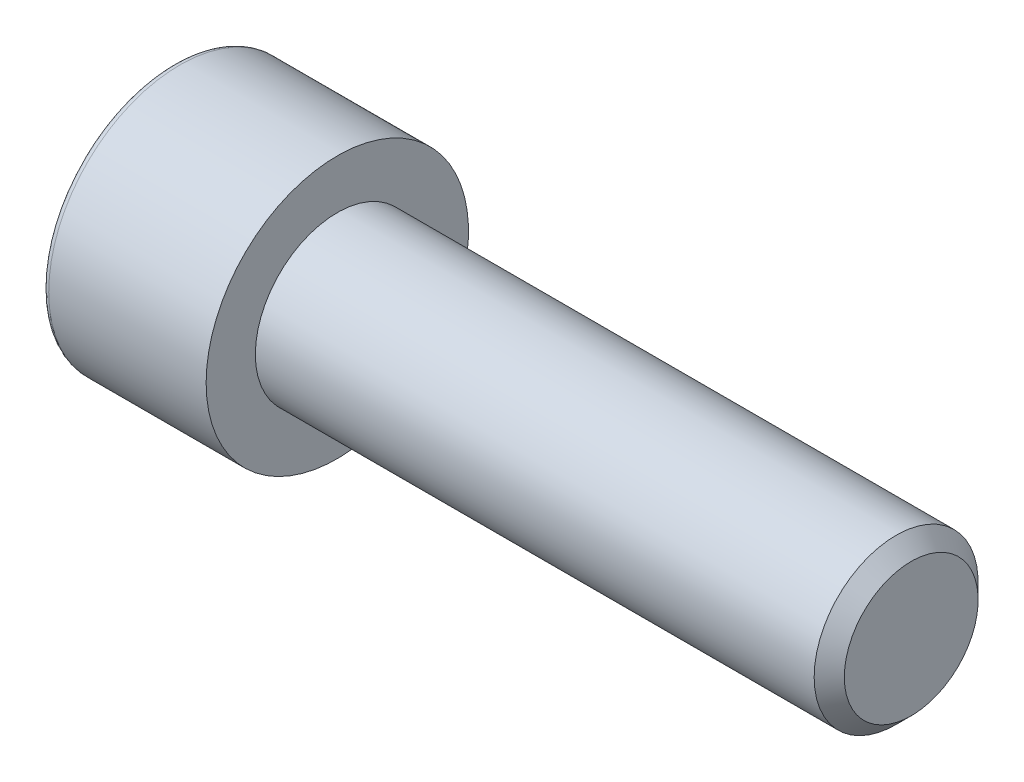
ISO-10303-21;
HEADER;
FILE_DESCRIPTION(('STEP AP214'),'2;1');
FILE_NAME('part.step','',(''),(''),'','','');
FILE_SCHEMA(('AUTOMOTIVE_DESIGN { 1 0 10303 214 1 1 1 1 }'));
ENDSEC;
DATA;
#1=APPLICATION_CONTEXT('core data for automotive mechanical design processes');
#2=APPLICATION_PROTOCOL_DEFINITION('international standard','automotive_design',2000,#1);
#3=PRODUCT_CONTEXT('',#1,'mechanical');
#4=PRODUCT('Part','Part','',(#3));
#5=PRODUCT_RELATED_PRODUCT_CATEGORY('part','',(#4));
#6=PRODUCT_DEFINITION_FORMATION('','',#4);
#7=PRODUCT_DEFINITION_CONTEXT('part definition',#1,'design');
#8=PRODUCT_DEFINITION('design','',#6,#7);
#9=PRODUCT_DEFINITION_SHAPE('','',#8);
#10=(LENGTH_UNIT() NAMED_UNIT(*) SI_UNIT(.MILLI.,.METRE.));
#11=(NAMED_UNIT(*) PLANE_ANGLE_UNIT() SI_UNIT($,.RADIAN.));
#12=(NAMED_UNIT(*) SI_UNIT($,.STERADIAN.) SOLID_ANGLE_UNIT());
#13=UNCERTAINTY_MEASURE_WITH_UNIT(LENGTH_MEASURE(1.E-05),#10,'distance_accuracy_value','');
#14=(GEOMETRIC_REPRESENTATION_CONTEXT(3) GLOBAL_UNCERTAINTY_ASSIGNED_CONTEXT((#13)) GLOBAL_UNIT_ASSIGNED_CONTEXT((#10,
#11,#12)) REPRESENTATION_CONTEXT('',''));
#15=CARTESIAN_POINT('',(0.,0.,0.));
#16=DIRECTION('',(0.,0.,1.));
#17=DIRECTION('',(1.,0.,0.));
#18=AXIS2_PLACEMENT_3D('',#15,#16,#17);
#19=CARTESIAN_POINT('',(0.,0.,0.));
#20=DIRECTION('',(1.,0.,0.));
#21=DIRECTION('',(0.,0.,-1.));
#22=AXIS2_PLACEMENT_3D('',#19,#20,#21);
#23=PLANE('',#22);
#24=DIRECTION('',(0.,-0.5,0.866025403784439));
#25=VECTOR('',#24,1.);
#26=CARTESIAN_POINT('',(0.,4.61880215351701,0.));
#27=LINE('',#26,#25);
#28=CARTESIAN_POINT('',(0.,4.61880215351701,0.));
#29=VERTEX_POINT('',#28);
#30=CARTESIAN_POINT('',(0.,2.3094010767585,4.));
#31=VERTEX_POINT('',#30);
#32=EDGE_CURVE('E100',#29,#31,#27,.T.);
#33=ORIENTED_EDGE('',*,*,#32,.T.);
#34=DIRECTION('',(0.,-1.,0.));
#35=VECTOR('',#34,1.);
#36=CARTESIAN_POINT('',(0.,2.3094010767585,4.));
#37=LINE('',#36,#35);
#38=CARTESIAN_POINT('',(0.,-2.3094010767585,4.));
#39=VERTEX_POINT('',#38);
#40=EDGE_CURVE('E107',#31,#39,#37,.T.);
#41=ORIENTED_EDGE('',*,*,#40,.T.);
#42=DIRECTION('',(0.,-0.5,-0.866025403784439));
#43=VECTOR('',#42,1.);
#44=CARTESIAN_POINT('',(0.,-2.3094010767585,4.));
#45=LINE('',#44,#43);
#46=CARTESIAN_POINT('',(0.,-4.61880215351701,0.));
#47=VERTEX_POINT('',#46);
#48=EDGE_CURVE('E113',#39,#47,#45,.T.);
#49=ORIENTED_EDGE('',*,*,#48,.T.);
#50=DIRECTION('',(0.,0.5,-0.866025403784439));
#51=VECTOR('',#50,1.);
#52=CARTESIAN_POINT('',(0.,-4.61880215351701,0.));
#53=LINE('',#52,#51);
#54=CARTESIAN_POINT('',(0.,-2.3094010767585,-4.));
#55=VERTEX_POINT('',#54);
#56=EDGE_CURVE('E122',#47,#55,#53,.T.);
#57=ORIENTED_EDGE('',*,*,#56,.T.);
#58=DIRECTION('',(0.,1.,0.));
#59=VECTOR('',#58,1.);
#60=CARTESIAN_POINT('',(0.,-2.3094010767585,-4.));
#61=LINE('',#60,#59);
#62=CARTESIAN_POINT('',(0.,2.3094010767585,-4.));
#63=VERTEX_POINT('',#62);
#64=EDGE_CURVE('E125',#55,#63,#61,.T.);
#65=ORIENTED_EDGE('',*,*,#64,.T.);
#66=DIRECTION('',(0.,0.5,0.866025403784439));
#67=VECTOR('',#66,1.);
#68=CARTESIAN_POINT('',(0.,2.3094010767585,-4.));
#69=LINE('',#68,#67);
#70=EDGE_CURVE('E118',#63,#29,#69,.T.);
#71=ORIENTED_EDGE('',*,*,#70,.T.);
#72=EDGE_LOOP('',(#33,#41,#49,#57,#65,#71));
#73=FACE_BOUND('',#72,.T.);
#74=CARTESIAN_POINT('',(0.,0.,0.));
#75=DIRECTION('',(-1.,0.,0.));
#76=DIRECTION('',(0.,0.,1.));
#77=AXIS2_PLACEMENT_3D('',#74,#75,#76);
#78=CIRCLE('',#77,7.6);
#79=CARTESIAN_POINT('',(0.,0.,7.6));
#80=VERTEX_POINT('',#79);
#81=EDGE_CURVE('E142',#80,#80,#78,.T.);
#82=ORIENTED_EDGE('',*,*,#81,.T.);
#83=EDGE_LOOP('',(#82));
#84=FACE_BOUND('',#83,.T.);
#85=ADVANCED_FACE('F39',(#73,#84),#23,.F.);
#86=CARTESIAN_POINT('',(10.,8.,0.));
#87=DIRECTION('',(-1.,0.,0.));
#88=DIRECTION('',(0.,0.,1.));
#89=AXIS2_PLACEMENT_3D('',#86,#87,#88);
#90=PLANE('',#89);
#91=CARTESIAN_POINT('',(10.,0.,0.));
#92=DIRECTION('',(-1.,0.,0.));
#93=DIRECTION('',(0.,0.,1.));
#94=AXIS2_PLACEMENT_3D('',#91,#92,#93);
#95=CIRCLE('',#94,8.);
#96=CARTESIAN_POINT('',(10.,0.,8.));
#97=VERTEX_POINT('',#96);
#98=EDGE_CURVE('E148',#97,#97,#95,.T.);
#99=ORIENTED_EDGE('',*,*,#98,.F.);
#100=EDGE_LOOP('',(#99));
#101=FACE_BOUND('',#100,.T.);
#102=CARTESIAN_POINT('',(10.,0.,0.));
#103=DIRECTION('',(-1.,0.,0.));
#104=DIRECTION('',(0.,0.,1.));
#105=AXIS2_PLACEMENT_3D('',#102,#103,#104);
#106=CIRCLE('',#105,5.);
#107=CARTESIAN_POINT('',(10.,0.,5.));
#108=VERTEX_POINT('',#107);
#109=EDGE_CURVE('E151',#108,#108,#106,.F.);
#110=ORIENTED_EDGE('',*,*,#109,.F.);
#111=EDGE_LOOP('',(#110));
#112=FACE_BOUND('',#111,.T.);
#113=ADVANCED_FACE('F210',(#101,#112),#90,.F.);
#114=CARTESIAN_POINT('',(10.,0.,0.));
#115=DIRECTION('',(-1.,0.,0.));
#116=DIRECTION('',(0.,0.,1.));
#117=AXIS2_PLACEMENT_3D('',#114,#115,#116);
#118=CYLINDRICAL_SURFACE('',#117,8.);
#119=CARTESIAN_POINT('',(0.399999999999999,0.,0.));
#120=DIRECTION('',(-1.,0.,0.));
#121=DIRECTION('',(0.,0.,1.));
#122=AXIS2_PLACEMENT_3D('',#119,#120,#121);
#123=CIRCLE('',#122,8.);
#124=CARTESIAN_POINT('',(0.399999999999999,0.,8.));
#125=VERTEX_POINT('',#124);
#126=EDGE_CURVE('E145',#125,#125,#123,.T.);
#127=ORIENTED_EDGE('',*,*,#126,.F.);
#128=EDGE_LOOP('',(#127));
#129=FACE_BOUND('',#128,.T.);
#130=ORIENTED_EDGE('',*,*,#98,.T.);
#131=EDGE_LOOP('',(#130));
#132=FACE_BOUND('',#131,.T.);
#133=ADVANCED_FACE('F214',(#129,#132),#118,.T.);
#134=CARTESIAN_POINT('',(0.400000000000002,0.,0.));
#135=DIRECTION('',(-1.,0.,0.));
#136=DIRECTION('',(0.,0.,1.));
#137=AXIS2_PLACEMENT_3D('',#134,#135,#136);
#138=TOROIDAL_SURFACE('',#137,7.6,0.400000000000002);
#139=ORIENTED_EDGE('',*,*,#126,.T.);
#140=EDGE_LOOP('',(#139));
#141=FACE_BOUND('',#140,.T.);
#142=ORIENTED_EDGE('',*,*,#81,.F.);
#143=EDGE_LOOP('',(#142));
#144=FACE_BOUND('',#143,.T.);
#145=ADVANCED_FACE('F220',(#141,#144),#138,.T.);
#146=CARTESIAN_POINT('',(45.,0.,0.));
#147=DIRECTION('',(-1.,0.,0.));
#148=DIRECTION('',(0.,0.,1.));
#149=AXIS2_PLACEMENT_3D('',#146,#147,#148);
#150=CYLINDRICAL_SURFACE('',#149,5.);
#151=ORIENTED_EDGE('',*,*,#109,.T.);
#152=EDGE_LOOP('',(#151));
#153=FACE_BOUND('',#152,.T.);
#154=CARTESIAN_POINT('',(44.08,0.,0.));
#155=DIRECTION('',(-1.,0.,0.));
#156=DIRECTION('',(0.,0.,1.));
#157=AXIS2_PLACEMENT_3D('',#154,#155,#156);
#158=CIRCLE('',#157,5.);
#159=CARTESIAN_POINT('',(44.08,0.,5.));
#160=VERTEX_POINT('',#159);
#161=EDGE_CURVE('E139',#160,#160,#158,.T.);
#162=ORIENTED_EDGE('',*,*,#161,.T.);
#163=EDGE_LOOP('',(#162));
#164=FACE_BOUND('',#163,.T.);
#165=ADVANCED_FACE('F227',(#153,#164),#150,.T.);
#166=CARTESIAN_POINT('',(45.,0.,0.));
#167=DIRECTION('',(-1.,0.,0.));
#168=DIRECTION('',(0.,0.,1.));
#169=AXIS2_PLACEMENT_3D('',#166,#167,#168);
#170=CONICAL_SURFACE('',#169,4.08,0.78539816339745);
#171=ORIENTED_EDGE('',*,*,#161,.F.);
#172=EDGE_LOOP('',(#171));
#173=FACE_BOUND('',#172,.T.);
#174=CARTESIAN_POINT('',(45.,0.,0.));
#175=DIRECTION('',(-1.,0.,0.));
#176=DIRECTION('',(0.,0.,1.));
#177=AXIS2_PLACEMENT_3D('',#174,#175,#176);
#178=CIRCLE('',#177,4.08);
#179=CARTESIAN_POINT('',(45.,0.,4.08));
#180=VERTEX_POINT('',#179);
#181=EDGE_CURVE('E103',#180,#180,#178,.T.);
#182=ORIENTED_EDGE('',*,*,#181,.T.);
#183=EDGE_LOOP('',(#182));
#184=FACE_BOUND('',#183,.T.);
#185=ADVANCED_FACE('F207',(#173,#184),#170,.T.);
#186=CARTESIAN_POINT('',(45.,4.08,0.));
#187=DIRECTION('',(-1.,0.,0.));
#188=DIRECTION('',(0.,0.,1.));
#189=AXIS2_PLACEMENT_3D('',#186,#187,#188);
#190=PLANE('',#189);
#191=ORIENTED_EDGE('',*,*,#181,.F.);
#192=EDGE_LOOP('',(#191));
#193=FACE_BOUND('',#192,.T.);
#194=ADVANCED_FACE('F203',(#193),#190,.F.);
#195=CARTESIAN_POINT('',(7.5,4.61880215351701,0.));
#196=DIRECTION('',(0.,-0.866025403784439,-0.5));
#197=DIRECTION('',(0.,0.5,-0.866025403784439));
#198=AXIS2_PLACEMENT_3D('',#195,#196,#197);
#199=PLANE('',#198);
#200=DIRECTION('',(-1.,0.,0.));
#201=VECTOR('',#200,1.);
#202=CARTESIAN_POINT('',(7.5,4.61880215351701,0.));
#203=LINE('',#202,#201);
#204=CARTESIAN_POINT('',(5.50875981387627,4.61880215351701,0.));
#205=VERTEX_POINT('',#204);
#206=EDGE_CURVE('E128',#205,#29,#203,.T.);
#207=ORIENTED_EDGE('',*,*,#206,.F.);
#208=CARTESIAN_POINT('',(5.50869314470967,4.61891762357084,-0.000200000000000067));
#209=CARTESIAN_POINT('',(5.56730753013615,4.5174314838138,0.175579150323228));
#210=CARTESIAN_POINT('',(5.62061508232217,4.41506932144052,0.352875616326381));
#211=CARTESIAN_POINT('',(5.71366373303804,4.20857250547739,0.710538593175707));
#212=CARTESIAN_POINT('',(5.75337191475473,4.10443418285647,0.890911458970152));
#213=CARTESIAN_POINT('',(5.81518318850416,3.89744813015756,1.24942181870279));
#214=CARTESIAN_POINT('',(5.83769767226155,3.79463224655059,1.42750415293514));
#215=CARTESIAN_POINT('',(5.86457478063786,3.58851671999023,1.78450671716651));
#216=CARTESIAN_POINT('',(5.8689596623575,3.48521782616117,1.9634256496441));
#217=CARTESIAN_POINT('',(5.85983533084447,3.29219970504619,2.29774284219673));
#218=CARTESIAN_POINT('',(5.84856644979644,3.20245157692486,2.45319115998707));
#219=CARTESIAN_POINT('',(5.81285141298625,3.02354002635497,2.76307505563506));
#220=CARTESIAN_POINT('',(5.78839305807291,2.93437722268073,2.91750956174413));
#221=CARTESIAN_POINT('',(5.72724933886515,2.75509682012354,3.22803232777458));
#222=CARTESIAN_POINT('',(5.69030480012957,2.6650019108942,3.3840812880631));
#223=CARTESIAN_POINT('',(5.60645533123641,2.48615580200001,3.69385183540384));
#224=CARTESIAN_POINT('',(5.5595701015717,2.39740231122585,3.84757739077378));
#225=CARTESIAN_POINT('',(5.50869314470967,2.30928560670467,4.0002));
#226=B_SPLINE_CURVE_WITH_KNOTS('',3,(#208,#209,#210,#211,#212,#213,#214,#215,#216,#217,#218,
#219,#220,#221,#222,#223,#224,#225),.UNSPECIFIED.,.F.,.F.,(4,2,2,2,2,2,2,2,4),(0.,
0.634047835695967,1.26961969224544,1.88946157213122,2.50854226669297,3.04757825393386,
3.58711366126903,4.13861653143764,4.68903648037743),.UNSPECIFIED.);
#227=CARTESIAN_POINT('',(5.50875981387627,2.3094010767585,4.));
#228=VERTEX_POINT('',#227);
#229=EDGE_CURVE('E11',#205,#228,#226,.T.);
#230=ORIENTED_EDGE('',*,*,#229,.T.);
#231=DIRECTION('',(-1.,0.,0.));
#232=VECTOR('',#231,1.);
#233=CARTESIAN_POINT('',(7.5,2.3094010767585,4.));
#234=LINE('',#233,#232);
#235=EDGE_CURVE('E95',#228,#31,#234,.T.);
#236=ORIENTED_EDGE('',*,*,#235,.T.);
#237=ORIENTED_EDGE('',*,*,#32,.F.);
#238=EDGE_LOOP('',(#207,#230,#236,#237));
#239=FACE_BOUND('',#238,.T.);
#240=ADVANCED_FACE('F98',(#239),#199,.T.);
#241=CARTESIAN_POINT('',(7.5,2.3094010767585,4.));
#242=DIRECTION('',(0.,0.,-1.));
#243=DIRECTION('',(-1.,0.,0.));
#244=AXIS2_PLACEMENT_3D('',#241,#242,#243);
#245=PLANE('',#244);
#246=ORIENTED_EDGE('',*,*,#235,.F.);
#247=CARTESIAN_POINT('',(3.94354028199412,-6.14219687020889,4.));
#248=CARTESIAN_POINT('',(4.02781886043131,-5.96794790820685,4.));
#249=CARTESIAN_POINT('',(4.1112712431811,-5.79329220516153,4.));
#250=CARTESIAN_POINT('',(4.27605749698906,-5.44295067722191,4.));
#251=CARTESIAN_POINT('',(4.3573910210582,-5.26726468930566,4.));
#252=CARTESIAN_POINT('',(4.51789559131225,-4.9137115275068,4.));
#253=CARTESIAN_POINT('',(4.59705190993723,-4.73583764392281,4.));
#254=CARTESIAN_POINT('',(4.75204081914724,-4.3786529638705,4.));
#255=CARTESIAN_POINT('',(4.82787357136717,-4.19934223778287,4.));
#256=CARTESIAN_POINT('',(4.97756599426233,-3.83354795816475,4.));
#257=CARTESIAN_POINT('',(5.05129681448237,-3.64701138014034,4.));
#258=CARTESIAN_POINT('',(5.19302867588892,-3.27173368338898,4.));
#259=CARTESIAN_POINT('',(5.26102906608826,-3.08299231695974,4.));
#260=CARTESIAN_POINT('',(5.38947067910711,-2.70337791551213,4.));
#261=CARTESIAN_POINT('',(5.44992772579046,-2.51251028991227,4.));
#262=CARTESIAN_POINT('',(5.56130299171829,-2.12803893695264,4.));
#263=CARTESIAN_POINT('',(5.61222427871484,-1.93443611116539,4.));
#264=CARTESIAN_POINT('',(5.70178981669437,-1.54539700813753,4.));
#265=CARTESIAN_POINT('',(5.74049527268171,-1.34997509010145,4.));
#266=CARTESIAN_POINT('',(5.80338144875533,-0.956767577393916,4.));
#267=CARTESIAN_POINT('',(5.8275634985397,-0.758982200801724,4.));
#268=CARTESIAN_POINT('',(5.85915627737315,-0.364593573659957,4.));
#269=CARTESIAN_POINT('',(5.86677790485912,-0.168007642138853,4.));
#270=CARTESIAN_POINT('',(5.86515524069861,0.225110928788071,4.));
#271=CARTESIAN_POINT('',(5.85591028664686,0.421643565797667,4.));
#272=CARTESIAN_POINT('',(5.8263829711374,0.757066530377883,4.));
#273=CARTESIAN_POINT('',(5.81002685757035,0.896322076214281,4.));
#274=CARTESIAN_POINT('',(5.76989774833414,1.1737678028723,4.));
#275=CARTESIAN_POINT('',(5.7461236966824,1.31195782913975,4.));
#276=CARTESIAN_POINT('',(5.66492925269978,1.72476553839906,4.));
#277=CARTESIAN_POINT('',(5.59765220019739,1.99746363974166,4.));
#278=CARTESIAN_POINT('',(5.48154179045784,2.40529838652711,4.));
#279=CARTESIAN_POINT('',(5.43975286725213,2.54256004628213,4.));
#280=CARTESIAN_POINT('',(5.35197942835464,2.81574824275356,4.));
#281=CARTESIAN_POINT('',(5.30599488253105,2.95167476987364,4.));
#282=CARTESIAN_POINT('',(5.21055635012265,3.22224052165401,4.));
#283=CARTESIAN_POINT('',(5.16110356342805,3.35688017338901,4.));
#284=CARTESIAN_POINT('',(5.05929609411142,3.62505173134586,4.));
#285=CARTESIAN_POINT('',(5.00694146401716,3.75858365756896,4.));
#286=CARTESIAN_POINT('',(4.86824444129387,4.10309505472078,4.));
#287=CARTESIAN_POINT('',(4.78005823651751,4.31333132131982,4.));
#288=CARTESIAN_POINT('',(4.59907360756611,4.73181577506894,4.));
#289=CARTESIAN_POINT('',(4.50627478764944,4.94006378980244,4.));
#290=CARTESIAN_POINT('',(4.31711081378477,5.35499786854983,4.));
#291=CARTESIAN_POINT('',(4.22074468831286,5.56168348832764,4.));
#292=CARTESIAN_POINT('',(4.02525056647811,5.97374694653681,4.));
#293=CARTESIAN_POINT('',(3.92612250008671,6.17912475164625,4.));
#294=CARTESIAN_POINT('',(3.72555345544338,6.58907957555133,4.));
#295=CARTESIAN_POINT('',(3.62410961574984,6.79365519179795,4.));
#296=CARTESIAN_POINT('',(3.41946471929128,7.20192647771324,4.));
#297=CARTESIAN_POINT('',(3.3162636462014,7.40562213918497,4.));
#298=CARTESIAN_POINT('',(3.00457662249434,8.01555233193743,4.));
#299=CARTESIAN_POINT('',(2.79397077991363,8.42070318159554,4.));
#300=CARTESIAN_POINT('',(2.38965197635198,9.18956082797048,4.));
#301=CARTESIAN_POINT('',(2.19629489034628,9.55345561966617,4.));
#302=CARTESIAN_POINT('',(1.80726389286389,10.2800266904784,4.));
#303=CARTESIAN_POINT('',(1.6115898693137,10.6427029095526,4.));
#304=CARTESIAN_POINT('',(1.21907245251046,11.3660831693921,4.));
#305=CARTESIAN_POINT('',(1.02223398137326,11.7267898850259,4.));
#306=CARTESIAN_POINT('',(0.627219976366942,12.4474401546969,4.));
#307=CARTESIAN_POINT('',(0.42904453055377,12.8073837569813,4.));
#308=CARTESIAN_POINT('',(0.230379022468632,13.1670549984861,4.));
#309=B_SPLINE_CURVE_WITH_KNOTS('',3,(#247,#248,#249,#250,#251,#252,#253,#254,#255,#256,#257,
#258,#259,#260,#261,#262,#263,#264,#265,#266,#267,#268,#269,#270,#271,#272,#273,#274,#275,#276,
#277,#278,#279,#280,#281,#282,#283,#284,#285,#286,#287,#288,#289,#290,#291,#292,#293,#294,#295,
#296,#297,#298,#299,#300,#301,#302,#303,#304,#305,#306,#307,#308),.UNSPECIFIED.,.F.,.F.,(4,2,2,
2,2,2,2,2,2,2,2,2,2,2,2,2,2,2,2,2,2,2,2,2,2,2,2,2,2,2,4),(0.,0.58068823135919,1.16147096723713,
1.7455187522928,2.32953810178213,2.93120382499618,3.53293780663747,4.13338749992812,
4.73364368925995,5.33084283051804,5.92798728655658,6.51748136093182,7.10699858714692,
7.52743207109351,7.94792543328959,8.78938398586867,9.21979528944551,9.65020968436315,
10.0804758985906,10.510734326888,11.194602225666,11.8785288988468,12.5626432238347,
13.2467749102444,13.931803355887,14.6168381689792,15.9866632254368,17.2228816731161,
18.4591601646954,19.6919152355464,20.9245898921393),.UNSPECIFIED.);
#310=CARTESIAN_POINT('',(5.50875981387627,-2.3094010767585,4.));
#311=VERTEX_POINT('',#310);
#312=EDGE_CURVE('E51',#228,#311,#309,.F.);
#313=ORIENTED_EDGE('',*,*,#312,.T.);
#314=DIRECTION('',(-1.,0.,0.));
#315=VECTOR('',#314,1.);
#316=CARTESIAN_POINT('',(7.5,-2.3094010767585,4.));
#317=LINE('',#316,#315);
#318=EDGE_CURVE('E104',#311,#39,#317,.T.);
#319=ORIENTED_EDGE('',*,*,#318,.T.);
#320=ORIENTED_EDGE('',*,*,#40,.F.);
#321=EDGE_LOOP('',(#246,#313,#319,#320));
#322=FACE_BOUND('',#321,.T.);
#323=ADVANCED_FACE('F108',(#322),#245,.T.);
#324=CARTESIAN_POINT('',(7.5,-2.3094010767585,4.));
#325=DIRECTION('',(0.,0.866025403784439,-0.5));
#326=DIRECTION('',(0.,0.5,0.866025403784439));
#327=AXIS2_PLACEMENT_3D('',#324,#325,#326);
#328=PLANE('',#327);
#329=ORIENTED_EDGE('',*,*,#318,.F.);
#330=CARTESIAN_POINT('',(5.50869314470967,-2.30928560670467,4.0002));
#331=CARTESIAN_POINT('',(5.56730753013615,-2.41077174646171,3.82442084967677));
#332=CARTESIAN_POINT('',(5.62061508232217,-2.513133908835,3.64712438367362));
#333=CARTESIAN_POINT('',(5.71366373303804,-2.71963072479812,3.28946140682429));
#334=CARTESIAN_POINT('',(5.75337191475473,-2.82376904741904,3.10908854102985));
#335=CARTESIAN_POINT('',(5.81518318850416,-3.03075510011795,2.75057818129721));
#336=CARTESIAN_POINT('',(5.83769767226155,-3.13357098372492,2.57249584706486));
#337=CARTESIAN_POINT('',(5.86457478063786,-3.33968651028528,2.21549328283349));
#338=CARTESIAN_POINT('',(5.8689596623575,-3.44298540411434,2.0365743503559));
#339=CARTESIAN_POINT('',(5.85983533084447,-3.63600352522932,1.70225715780327));
#340=CARTESIAN_POINT('',(5.84856644979644,-3.72575165335065,1.54680884001293));
#341=CARTESIAN_POINT('',(5.81285141298625,-3.90466320392054,1.23692494436494));
#342=CARTESIAN_POINT('',(5.7883930580729,-3.99382600759478,1.08249043825587));
#343=CARTESIAN_POINT('',(5.72724933886515,-4.17310641015197,0.771967672225422));
#344=CARTESIAN_POINT('',(5.69030480012957,-4.26320131938131,0.615918711936898));
#345=CARTESIAN_POINT('',(5.60645533123641,-4.4420474282755,0.306148164596161));
#346=CARTESIAN_POINT('',(5.5595701015717,-4.53080091904966,0.152422609226221));
#347=CARTESIAN_POINT('',(5.50869314470967,-4.61891762357084,-0.000199999999999375));
#348=B_SPLINE_CURVE_WITH_KNOTS('',3,(#330,#331,#332,#333,#334,#335,#336,#337,#338,#339,#340,
#341,#342,#343,#344,#345,#346,#347),.UNSPECIFIED.,.F.,.F.,(4,2,2,2,2,2,2,2,4),(0.,
0.634047835695966,1.26961969224543,1.88946157213122,2.50854226669297,3.04757825393386,
3.58711366126904,4.13861653143764,4.68903648037743),.UNSPECIFIED.);
#349=CARTESIAN_POINT('',(5.50875981387627,-4.61880215351701,0.));
#350=VERTEX_POINT('',#349);
#351=EDGE_CURVE('E61',#311,#350,#348,.T.);
#352=ORIENTED_EDGE('',*,*,#351,.T.);
#353=DIRECTION('',(-1.,0.,0.));
#354=VECTOR('',#353,1.);
#355=CARTESIAN_POINT('',(7.5,-4.61880215351701,0.));
#356=LINE('',#355,#354);
#357=EDGE_CURVE('E134',#350,#47,#356,.T.);
#358=ORIENTED_EDGE('',*,*,#357,.T.);
#359=ORIENTED_EDGE('',*,*,#48,.F.);
#360=EDGE_LOOP('',(#329,#352,#358,#359));
#361=FACE_BOUND('',#360,.T.);
#362=ADVANCED_FACE('F183',(#361),#328,.T.);
#363=CARTESIAN_POINT('',(7.5,-4.61880215351701,0.));
#364=DIRECTION('',(0.,0.866025403784439,0.5));
#365=DIRECTION('',(0.,-0.5,0.866025403784439));
#366=AXIS2_PLACEMENT_3D('',#363,#364,#365);
#367=PLANE('',#366);
#368=ORIENTED_EDGE('',*,*,#357,.F.);
#369=CARTESIAN_POINT('',(5.50869314470967,-4.61891762357084,0.000200000000000067));
#370=CARTESIAN_POINT('',(5.56730753013615,-4.5174314838138,-0.175579150323228));
#371=CARTESIAN_POINT('',(5.62061508232217,-4.41506932144052,-0.352875616326381));
#372=CARTESIAN_POINT('',(5.71366373303804,-4.20857250547739,-0.710538593175707));
#373=CARTESIAN_POINT('',(5.75337191475473,-4.10443418285647,-0.890911458970152));
#374=CARTESIAN_POINT('',(5.81518318850416,-3.89744813015756,-1.24942181870279));
#375=CARTESIAN_POINT('',(5.83769767226155,-3.79463224655059,-1.42750415293514));
#376=CARTESIAN_POINT('',(5.86457478063786,-3.58851671999023,-1.78450671716651));
#377=CARTESIAN_POINT('',(5.8689596623575,-3.48521782616117,-1.9634256496441));
#378=CARTESIAN_POINT('',(5.85983533084447,-3.29219970504619,-2.29774284219673));
#379=CARTESIAN_POINT('',(5.84856644979644,-3.20245157692486,-2.45319115998707));
#380=CARTESIAN_POINT('',(5.81285141298625,-3.02354002635497,-2.76307505563506));
#381=CARTESIAN_POINT('',(5.78839305807291,-2.93437722268073,-2.91750956174413));
#382=CARTESIAN_POINT('',(5.72724933886515,-2.75509682012354,-3.22803232777458));
#383=CARTESIAN_POINT('',(5.69030480012957,-2.6650019108942,-3.3840812880631));
#384=CARTESIAN_POINT('',(5.60645533123641,-2.48615580200001,-3.69385183540384));
#385=CARTESIAN_POINT('',(5.5595701015717,-2.39740231122585,-3.84757739077378));
#386=CARTESIAN_POINT('',(5.50869314470967,-2.30928560670467,-4.0002));
#387=B_SPLINE_CURVE_WITH_KNOTS('',3,(#369,#370,#371,#372,#373,#374,#375,#376,#377,#378,#379,
#380,#381,#382,#383,#384,#385,#386),.UNSPECIFIED.,.F.,.F.,(4,2,2,2,2,2,2,2,4),(0.,
0.634047835695967,1.26961969224544,1.88946157213122,2.50854226669297,3.04757825393386,
3.58711366126903,4.13861653143764,4.68903648037743),.UNSPECIFIED.);
#388=CARTESIAN_POINT('',(5.50875981387627,-2.3094010767585,-4.));
#389=VERTEX_POINT('',#388);
#390=EDGE_CURVE('E187',#350,#389,#387,.T.);
#391=ORIENTED_EDGE('',*,*,#390,.T.);
#392=DIRECTION('',(-1.,0.,0.));
#393=VECTOR('',#392,1.);
#394=CARTESIAN_POINT('',(7.5,-2.3094010767585,-4.));
#395=LINE('',#394,#393);
#396=EDGE_CURVE('E132',#389,#55,#395,.T.);
#397=ORIENTED_EDGE('',*,*,#396,.T.);
#398=ORIENTED_EDGE('',*,*,#56,.F.);
#399=EDGE_LOOP('',(#368,#391,#397,#398));
#400=FACE_BOUND('',#399,.T.);
#401=ADVANCED_FACE('F178',(#400),#367,.T.);
#402=CARTESIAN_POINT('',(7.5,-2.3094010767585,-4.));
#403=DIRECTION('',(0.,0.,1.));
#404=DIRECTION('',(1.,0.,0.));
#405=AXIS2_PLACEMENT_3D('',#402,#403,#404);
#406=PLANE('',#405);
#407=ORIENTED_EDGE('',*,*,#396,.F.);
#408=CARTESIAN_POINT('',(3.94354028199412,-6.14219687020889,-4.));
#409=CARTESIAN_POINT('',(4.02781886043131,-5.96794790820685,-4.));
#410=CARTESIAN_POINT('',(4.1112712431811,-5.79329220516153,-4.));
#411=CARTESIAN_POINT('',(4.27605749698906,-5.44295067722191,-4.));
#412=CARTESIAN_POINT('',(4.3573910210582,-5.26726468930566,-4.));
#413=CARTESIAN_POINT('',(4.51789559131225,-4.9137115275068,-4.));
#414=CARTESIAN_POINT('',(4.59705190993723,-4.73583764392281,-4.));
#415=CARTESIAN_POINT('',(4.75204081914724,-4.3786529638705,-4.));
#416=CARTESIAN_POINT('',(4.82787357136717,-4.19934223778287,-4.));
#417=CARTESIAN_POINT('',(4.97756599426233,-3.83354795816475,-4.));
#418=CARTESIAN_POINT('',(5.05129681448237,-3.64701138014034,-4.));
#419=CARTESIAN_POINT('',(5.19302867588892,-3.27173368338898,-4.));
#420=CARTESIAN_POINT('',(5.26102906608826,-3.08299231695974,-4.));
#421=CARTESIAN_POINT('',(5.38947067910711,-2.70337791551213,-4.));
#422=CARTESIAN_POINT('',(5.44992772579046,-2.51251028991227,-4.));
#423=CARTESIAN_POINT('',(5.56130299171829,-2.12803893695264,-4.));
#424=CARTESIAN_POINT('',(5.61222427871484,-1.93443611116539,-4.));
#425=CARTESIAN_POINT('',(5.70178981669437,-1.54539700813753,-4.));
#426=CARTESIAN_POINT('',(5.74049527268171,-1.34997509010145,-4.));
#427=CARTESIAN_POINT('',(5.80338144875533,-0.956767577393916,-4.));
#428=CARTESIAN_POINT('',(5.8275634985397,-0.758982200801724,-4.));
#429=CARTESIAN_POINT('',(5.85915627737315,-0.364593573659957,-4.));
#430=CARTESIAN_POINT('',(5.86677790485912,-0.168007642138853,-4.));
#431=CARTESIAN_POINT('',(5.86515524069861,0.225110928788071,-4.));
#432=CARTESIAN_POINT('',(5.85591028664686,0.421643565797667,-4.));
#433=CARTESIAN_POINT('',(5.8263829711374,0.757066530377883,-4.));
#434=CARTESIAN_POINT('',(5.81002685757035,0.896322076214281,-4.));
#435=CARTESIAN_POINT('',(5.76989774833414,1.1737678028723,-4.));
#436=CARTESIAN_POINT('',(5.7461236966824,1.31195782913975,-4.));
#437=CARTESIAN_POINT('',(5.66492925269978,1.72476553839906,-4.));
#438=CARTESIAN_POINT('',(5.59765220019739,1.99746363974166,-4.));
#439=CARTESIAN_POINT('',(5.48154179045784,2.40529838652711,-4.));
#440=CARTESIAN_POINT('',(5.43975286725213,2.54256004628213,-4.));
#441=CARTESIAN_POINT('',(5.35197942835464,2.81574824275356,-4.));
#442=CARTESIAN_POINT('',(5.30599488253105,2.95167476987364,-4.));
#443=CARTESIAN_POINT('',(5.21055635012265,3.22224052165401,-4.));
#444=CARTESIAN_POINT('',(5.16110356342805,3.35688017338901,-4.));
#445=CARTESIAN_POINT('',(5.05929609411142,3.62505173134586,-4.));
#446=CARTESIAN_POINT('',(5.00694146401716,3.75858365756896,-4.));
#447=CARTESIAN_POINT('',(4.86824444129387,4.10309505472078,-4.));
#448=CARTESIAN_POINT('',(4.78005823651751,4.31333132131982,-4.));
#449=CARTESIAN_POINT('',(4.59907360756611,4.73181577506894,-4.));
#450=CARTESIAN_POINT('',(4.50627478764944,4.94006378980244,-4.));
#451=CARTESIAN_POINT('',(4.31711081378477,5.35499786854983,-4.));
#452=CARTESIAN_POINT('',(4.22074468831286,5.56168348832764,-4.));
#453=CARTESIAN_POINT('',(4.02525056647811,5.97374694653681,-4.));
#454=CARTESIAN_POINT('',(3.92612250008671,6.17912475164625,-4.));
#455=CARTESIAN_POINT('',(3.72555345544338,6.58907957555133,-4.));
#456=CARTESIAN_POINT('',(3.62410961574984,6.79365519179795,-4.));
#457=CARTESIAN_POINT('',(3.41946471929128,7.20192647771324,-4.));
#458=CARTESIAN_POINT('',(3.3162636462014,7.40562213918497,-4.));
#459=CARTESIAN_POINT('',(3.00457662249434,8.01555233193743,-4.));
#460=CARTESIAN_POINT('',(2.79397077991363,8.42070318159554,-4.));
#461=CARTESIAN_POINT('',(2.38965197635198,9.18956082797048,-4.));
#462=CARTESIAN_POINT('',(2.19629489034628,9.55345561966617,-4.));
#463=CARTESIAN_POINT('',(1.80726389286389,10.2800266904784,-4.));
#464=CARTESIAN_POINT('',(1.6115898693137,10.6427029095526,-4.));
#465=CARTESIAN_POINT('',(1.21907245251046,11.3660831693921,-4.));
#466=CARTESIAN_POINT('',(1.02223398137326,11.7267898850259,-4.));
#467=CARTESIAN_POINT('',(0.627219976366942,12.4474401546969,-4.));
#468=CARTESIAN_POINT('',(0.42904453055377,12.8073837569813,-4.));
#469=CARTESIAN_POINT('',(0.230379022468632,13.1670549984861,-4.));
#470=B_SPLINE_CURVE_WITH_KNOTS('',3,(#408,#409,#410,#411,#412,#413,#414,#415,#416,#417,#418,
#419,#420,#421,#422,#423,#424,#425,#426,#427,#428,#429,#430,#431,#432,#433,#434,#435,#436,#437,
#438,#439,#440,#441,#442,#443,#444,#445,#446,#447,#448,#449,#450,#451,#452,#453,#454,#455,#456,
#457,#458,#459,#460,#461,#462,#463,#464,#465,#466,#467,#468,#469),.UNSPECIFIED.,.F.,.F.,(4,2,2,
2,2,2,2,2,2,2,2,2,2,2,2,2,2,2,2,2,2,2,2,2,2,2,2,2,2,2,4),(0.,0.58068823135919,1.16147096723713,
1.7455187522928,2.32953810178213,2.93120382499618,3.53293780663747,4.13338749992812,
4.73364368925995,5.33084283051804,5.92798728655658,6.51748136093182,7.10699858714692,
7.52743207109351,7.94792543328959,8.78938398586867,9.21979528944551,9.65020968436315,
10.0804758985906,10.510734326888,11.194602225666,11.8785288988468,12.5626432238347,
13.2467749102444,13.931803355887,14.6168381689792,15.9866632254368,17.2228816731161,
18.4591601646954,19.6919152355464,20.9245898921393),.UNSPECIFIED.);
#471=CARTESIAN_POINT('',(5.50875981387627,2.3094010767585,-4.));
#472=VERTEX_POINT('',#471);
#473=EDGE_CURVE('E161',#389,#472,#470,.T.);
#474=ORIENTED_EDGE('',*,*,#473,.T.);
#475=DIRECTION('',(-1.,0.,0.));
#476=VECTOR('',#475,1.);
#477=CARTESIAN_POINT('',(7.5,2.3094010767585,-4.));
#478=LINE('',#477,#476);
#479=EDGE_CURVE('E130',#472,#63,#478,.T.);
#480=ORIENTED_EDGE('',*,*,#479,.T.);
#481=ORIENTED_EDGE('',*,*,#64,.F.);
#482=EDGE_LOOP('',(#407,#474,#480,#481));
#483=FACE_BOUND('',#482,.T.);
#484=ADVANCED_FACE('F173',(#483),#406,.T.);
#485=CARTESIAN_POINT('',(7.5,2.3094010767585,-4.));
#486=DIRECTION('',(0.,-0.866025403784439,0.5));
#487=DIRECTION('',(0.,-0.5,-0.866025403784439));
#488=AXIS2_PLACEMENT_3D('',#485,#486,#487);
#489=PLANE('',#488);
#490=ORIENTED_EDGE('',*,*,#479,.F.);
#491=CARTESIAN_POINT('',(5.50869314470967,2.30928560670467,-4.0002));
#492=CARTESIAN_POINT('',(5.56730753013615,2.41077174646171,-3.82442084967677));
#493=CARTESIAN_POINT('',(5.62061508232217,2.513133908835,-3.64712438367362));
#494=CARTESIAN_POINT('',(5.71366373303804,2.71963072479812,-3.28946140682429));
#495=CARTESIAN_POINT('',(5.75337191475473,2.82376904741904,-3.10908854102985));
#496=CARTESIAN_POINT('',(5.81518318850416,3.03075510011795,-2.75057818129721));
#497=CARTESIAN_POINT('',(5.83769767226155,3.13357098372492,-2.57249584706486));
#498=CARTESIAN_POINT('',(5.86457478063786,3.33968651028528,-2.21549328283349));
#499=CARTESIAN_POINT('',(5.8689596623575,3.44298540411434,-2.0365743503559));
#500=CARTESIAN_POINT('',(5.85983533084447,3.63600352522932,-1.70225715780327));
#501=CARTESIAN_POINT('',(5.84856644979644,3.72575165335065,-1.54680884001293));
#502=CARTESIAN_POINT('',(5.81285141298625,3.90466320392054,-1.23692494436494));
#503=CARTESIAN_POINT('',(5.7883930580729,3.99382600759478,-1.08249043825587));
#504=CARTESIAN_POINT('',(5.72724933886515,4.17310641015197,-0.771967672225422));
#505=CARTESIAN_POINT('',(5.69030480012957,4.26320131938131,-0.615918711936898));
#506=CARTESIAN_POINT('',(5.60645533123641,4.4420474282755,-0.306148164596161));
#507=CARTESIAN_POINT('',(5.5595701015717,4.53080091904966,-0.152422609226221));
#508=CARTESIAN_POINT('',(5.50869314470967,4.61891762357084,0.000199999999999375));
#509=B_SPLINE_CURVE_WITH_KNOTS('',3,(#491,#492,#493,#494,#495,#496,#497,#498,#499,#500,#501,
#502,#503,#504,#505,#506,#507,#508),.UNSPECIFIED.,.F.,.F.,(4,2,2,2,2,2,2,2,4),(0.,
0.634047835695966,1.26961969224543,1.88946157213122,2.50854226669297,3.04757825393386,
3.58711366126904,4.13861653143764,4.68903648037743),.UNSPECIFIED.);
#510=EDGE_CURVE('E154',#472,#205,#509,.T.);
#511=ORIENTED_EDGE('',*,*,#510,.T.);
#512=ORIENTED_EDGE('',*,*,#206,.T.);
#513=ORIENTED_EDGE('',*,*,#70,.F.);
#514=EDGE_LOOP('',(#490,#511,#512,#513));
#515=FACE_BOUND('',#514,.T.);
#516=ADVANCED_FACE('F170',(#515),#489,.T.);
#517=CARTESIAN_POINT('',(8.17542648054294,0.,0.));
#518=DIRECTION('',(-1.,0.,0.));
#519=DIRECTION('',(0.,0.,1.));
#520=AXIS2_PLACEMENT_3D('',#517,#518,#519);
#521=CONICAL_SURFACE('',#520,0.,1.0471975511966);
#522=ORIENTED_EDGE('',*,*,#229,.F.);
#523=ORIENTED_EDGE('',*,*,#510,.F.);
#524=ORIENTED_EDGE('',*,*,#473,.F.);
#525=ORIENTED_EDGE('',*,*,#390,.F.);
#526=ORIENTED_EDGE('',*,*,#351,.F.);
#527=ORIENTED_EDGE('',*,*,#312,.F.);
#528=EDGE_LOOP('',(#522,#523,#524,#525,#526,#527));
#529=FACE_BOUND('',#528,.T.);
#530=CARTESIAN_POINT('',(8.17542648054294,0.,0.));
#531=VERTEX_POINT('',#530);
#532=VERTEX_LOOP('',#531);
#533=FACE_BOUND('',#532,.T.);
#534=ADVANCED_FACE('F167',(#529,#533),#521,.F.);
#535=CLOSED_SHELL('',(#85,#113,#133,#145,#165,#185,#194,#240,#323,#362,#401,#484,#516,#534));
#536=MANIFOLD_SOLID_BREP('B2',#535);
#537=ADVANCED_BREP_SHAPE_REPRESENTATION('',(#18,#536),#14);
#538=SHAPE_DEFINITION_REPRESENTATION(#9,#537);
ENDSEC;
END-ISO-10303-21;
